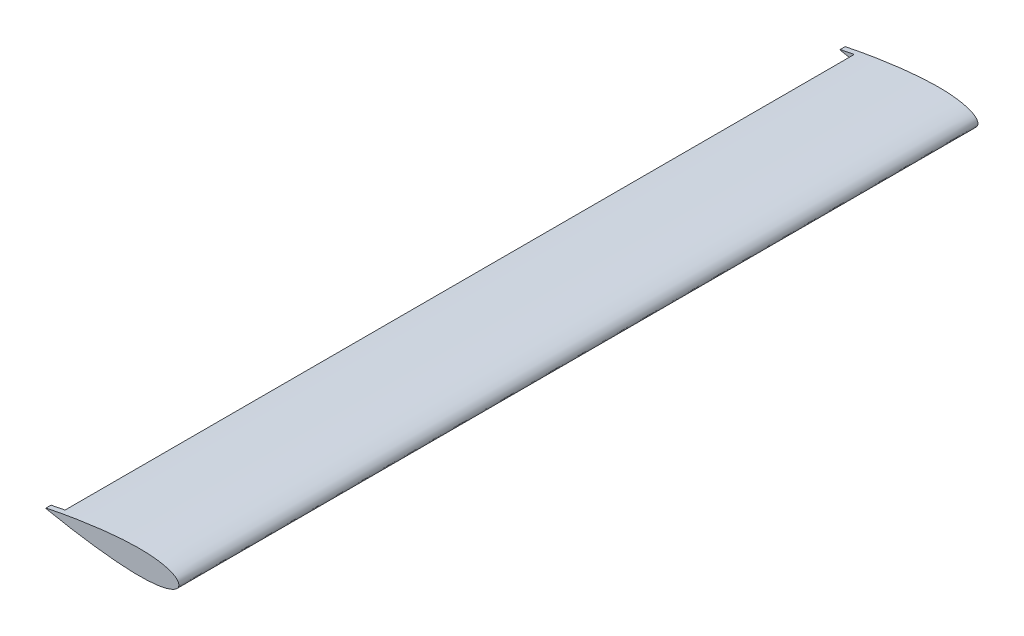
ISO-10303-21;
HEADER;
FILE_DESCRIPTION(('STEP AP214'),'2;1');
FILE_NAME('part.step','',(''),(''),'','','');
FILE_SCHEMA(('AUTOMOTIVE_DESIGN { 1 0 10303 214 1 1 1 1 }'));
ENDSEC;
DATA;
#1=APPLICATION_CONTEXT('core data for automotive mechanical design processes');
#2=APPLICATION_PROTOCOL_DEFINITION('international standard','automotive_design',2000,#1);
#3=PRODUCT_CONTEXT('',#1,'mechanical');
#4=PRODUCT('Part','Part','',(#3));
#5=PRODUCT_RELATED_PRODUCT_CATEGORY('part','',(#4));
#6=PRODUCT_DEFINITION_FORMATION('','',#4);
#7=PRODUCT_DEFINITION_CONTEXT('part definition',#1,'design');
#8=PRODUCT_DEFINITION('design','',#6,#7);
#9=PRODUCT_DEFINITION_SHAPE('','',#8);
#10=(LENGTH_UNIT() NAMED_UNIT(*) SI_UNIT(.MILLI.,.METRE.));
#11=(NAMED_UNIT(*) PLANE_ANGLE_UNIT() SI_UNIT($,.RADIAN.));
#12=(NAMED_UNIT(*) SI_UNIT($,.STERADIAN.) SOLID_ANGLE_UNIT());
#13=UNCERTAINTY_MEASURE_WITH_UNIT(LENGTH_MEASURE(1.E-05),#10,'distance_accuracy_value','');
#14=(GEOMETRIC_REPRESENTATION_CONTEXT(3) GLOBAL_UNCERTAINTY_ASSIGNED_CONTEXT((#13)) GLOBAL_UNIT_ASSIGNED_CONTEXT((#10,
#11,#12)) REPRESENTATION_CONTEXT('',''));
#15=CARTESIAN_POINT('',(0.,0.,0.));
#16=DIRECTION('',(0.,0.,1.));
#17=DIRECTION('',(1.,0.,0.));
#18=AXIS2_PLACEMENT_3D('',#15,#16,#17);
#19=CARTESIAN_POINT('',(-265.999999999999,-0.503000000467428,800.));
#20=CARTESIAN_POINT('',(-261.568824613127,-1.41910493794682,800.));
#21=CARTESIAN_POINT('',(-252.716442874089,-3.24925380626102,800.));
#22=CARTESIAN_POINT('',(-234.995464142612,-6.64481991794921,800.));
#23=CARTESIAN_POINT('',(-212.843288824471,-10.5485288362705,800.));
#24=CARTESIAN_POINT('',(-186.239809232107,-14.7042798016418,800.));
#25=CARTESIAN_POINT('',(-159.640651569451,-18.3128469708548,800.));
#26=CARTESIAN_POINT('',(-133.040852361654,-21.2623525177975,800.));
#27=CARTESIAN_POINT('',(-106.434765804828,-23.3530401063583,800.));
#28=CARTESIAN_POINT('',(-84.236960535237,-24.0962408200567,800.));
#29=CARTESIAN_POINT('',(-66.4892669119629,-23.7998937302964,800.));
#30=CARTESIAN_POINT('',(-53.1677388629969,-23.0109475445305,800.));
#31=CARTESIAN_POINT('',(-39.8211485531244,-21.4880571787925,800.));
#32=CARTESIAN_POINT('',(-28.7128335803096,-19.3599045445356,800.));
#33=CARTESIAN_POINT('',(-19.8529586715222,-16.8284915630262,800.));
#34=CARTESIAN_POINT('',(-13.0873654133834,-14.2708296517311,800.));
#35=CARTESIAN_POINT('',(-7.41956020196074,-11.1922678624387,800.));
#36=CARTESIAN_POINT('',(-2.20731315294942,-6.93210672242582,800.));
#37=CARTESIAN_POINT('',(1.44035156805781,2.05190266769401E-10,800.));
#38=CARTESIAN_POINT('',(-2.20731315298429,6.9321067228178,800.));
#39=CARTESIAN_POINT('',(-7.41956020201701,11.1922678628044,800.));
#40=CARTESIAN_POINT('',(-13.0873654134552,14.2708296520684,800.));
#41=CARTESIAN_POINT('',(-19.8529586716068,16.8284915633294,800.));
#42=CARTESIAN_POINT('',(-28.712833580407,19.3599045447942,800.));
#43=CARTESIAN_POINT('',(-39.8211485532324,21.4880571789953,800.));
#44=CARTESIAN_POINT('',(-53.1677388631127,23.0109475446662,800.));
#45=CARTESIAN_POINT('',(-66.4892669120825,23.799893730365,800.));
#46=CARTESIAN_POINT('',(-84.2369605353583,24.0962408200361,800.));
#47=CARTESIAN_POINT('',(-106.434765804945,23.353040106226,800.));
#48=CARTESIAN_POINT('',(-133.040852361761,21.2623525175314,800.));
#49=CARTESIAN_POINT('',(-159.640651569543,18.3128469704549,800.));
#50=CARTESIAN_POINT('',(-186.239809232181,14.7042798011081,800.));
#51=CARTESIAN_POINT('',(-212.843288824524,10.548528835603,800.));
#52=CARTESIAN_POINT('',(-234.995464142645,6.6448199171703,800.));
#53=CARTESIAN_POINT('',(-252.716442874106,3.24925380539299,800.));
#54=CARTESIAN_POINT('',(-261.568824613134,1.41910493703425,800.));
#55=CARTESIAN_POINT('',(-266.000000000001,0.502999999532572,800.));
#56=B_SPLINE_CURVE_WITH_KNOTS('',3,(#19,#20,#21,#22,#23,#24,#25,#26,#27,#28,#29,#30,#31,#32,#33,
#34,#35,#36,#37,#38,#39,#40,#41,#42,#43,#44,#45,#46,#47,#48,#49,#50,#51,#52,#53,#54,#55),
.UNSPECIFIED.,.F.,.F.,(4,1,1,1,1,1,1,1,1,1,1,1,1,1,1,1,1,1,1,1,1,1,1,1,1,1,1,1,1,1,1,1,1,1,4),
(0.,0.0246038933451094,0.0491524340929429,0.0981085566584546,0.146905125159748,
0.195554766723559,0.244056172228335,0.2924094136053,0.340643604803074,0.364753980610275,
0.388905472973926,0.413177962040512,0.437756077223996,0.45030461507737,0.463229874886268,
0.477067413917468,0.485035659177221,0.5,0.514964340822779,0.522932586082532,0.536770125113732,
0.54969538492263,0.562243922776004,0.586822037959488,0.611094527026074,0.635246019389725,
0.659356395196926,0.7075905863947,0.755943827771665,0.804445233276441,0.853094874840252,
0.901891443341545,0.950847565907057,0.975396106654891,1.),.UNSPECIFIED.);
#57=DIRECTION('',(0.,0.,-1.));
#58=VECTOR('',#57,1.);
#59=SURFACE_OF_LINEAR_EXTRUSION('',#56,#58);
#60=CARTESIAN_POINT('',(-265.999999999999,-0.503000000467428,-790.));
#61=CARTESIAN_POINT('',(-261.568824613127,-1.41910493794682,-790.));
#62=CARTESIAN_POINT('',(-252.716442874089,-3.24925380626102,-790.));
#63=CARTESIAN_POINT('',(-234.995464142612,-6.64481991794921,-790.));
#64=CARTESIAN_POINT('',(-212.843288824471,-10.5485288362705,-790.));
#65=CARTESIAN_POINT('',(-186.239809232107,-14.7042798016418,-790.));
#66=CARTESIAN_POINT('',(-159.640651569451,-18.3128469708548,-790.));
#67=CARTESIAN_POINT('',(-133.040852361654,-21.2623525177975,-790.));
#68=CARTESIAN_POINT('',(-106.434765804828,-23.3530401063583,-790.));
#69=CARTESIAN_POINT('',(-84.236960535237,-24.0962408200567,-790.));
#70=CARTESIAN_POINT('',(-66.4892669119629,-23.7998937302964,-790.));
#71=CARTESIAN_POINT('',(-53.1677388629969,-23.0109475445305,-790.));
#72=CARTESIAN_POINT('',(-39.8211485531244,-21.4880571787925,-790.));
#73=CARTESIAN_POINT('',(-28.7128335803096,-19.3599045445356,-790.));
#74=CARTESIAN_POINT('',(-19.8529586715222,-16.8284915630262,-790.));
#75=CARTESIAN_POINT('',(-13.0873654133834,-14.2708296517311,-790.));
#76=CARTESIAN_POINT('',(-7.41956020196074,-11.1922678624387,-790.));
#77=CARTESIAN_POINT('',(-2.20731315294942,-6.93210672242582,-790.));
#78=CARTESIAN_POINT('',(1.44035156805781,2.05190266769401E-10,-790.));
#79=CARTESIAN_POINT('',(-2.20731315298429,6.9321067228178,-790.));
#80=CARTESIAN_POINT('',(-7.41956020201701,11.1922678628044,-790.));
#81=CARTESIAN_POINT('',(-13.0873654134552,14.2708296520684,-790.));
#82=CARTESIAN_POINT('',(-19.8529586716068,16.8284915633294,-790.));
#83=CARTESIAN_POINT('',(-28.712833580407,19.3599045447942,-790.));
#84=CARTESIAN_POINT('',(-39.8211485532324,21.4880571789953,-790.));
#85=CARTESIAN_POINT('',(-53.1677388631127,23.0109475446662,-790.));
#86=CARTESIAN_POINT('',(-66.4892669120825,23.799893730365,-790.));
#87=CARTESIAN_POINT('',(-84.2369605353583,24.0962408200361,-790.));
#88=CARTESIAN_POINT('',(-106.434765804945,23.353040106226,-790.));
#89=CARTESIAN_POINT('',(-133.040852361761,21.2623525175314,-790.));
#90=CARTESIAN_POINT('',(-159.640651569543,18.3128469704549,-790.));
#91=CARTESIAN_POINT('',(-186.239809232181,14.7042798011081,-790.));
#92=CARTESIAN_POINT('',(-212.843288824524,10.548528835603,-790.));
#93=CARTESIAN_POINT('',(-234.995464142645,6.6448199171703,-790.));
#94=CARTESIAN_POINT('',(-252.716442874106,3.24925380539299,-790.));
#95=CARTESIAN_POINT('',(-261.568824613134,1.41910493703425,-790.));
#96=CARTESIAN_POINT('',(-266.000000000001,0.502999999532572,-790.));
#97=B_SPLINE_CURVE_WITH_KNOTS('',3,(#60,#61,#62,#63,#64,#65,#66,#67,#68,#69,#70,#71,#72,#73,#74,
#75,#76,#77,#78,#79,#80,#81,#82,#83,#84,#85,#86,#87,#88,#89,#90,#91,#92,#93,#94,#95,#96),
.UNSPECIFIED.,.F.,.F.,(4,1,1,1,1,1,1,1,1,1,1,1,1,1,1,1,1,1,1,1,1,1,1,1,1,1,1,1,1,1,1,1,1,1,4),
(0.,0.0246038933451094,0.0491524340929429,0.0981085566584546,0.146905125159748,
0.195554766723559,0.244056172228335,0.2924094136053,0.340643604803074,0.364753980610275,
0.388905472973926,0.413177962040512,0.437756077223996,0.45030461507737,0.463229874886268,
0.477067413917468,0.485035659177221,0.5,0.514964340822779,0.522932586082532,0.536770125113732,
0.54969538492263,0.562243922776004,0.586822037959488,0.611094527026074,0.635246019389725,
0.659356395196926,0.7075905863947,0.755943827771665,0.804445233276441,0.853094874840252,
0.901891443341545,0.950847565907057,0.975396106654891,1.),.UNSPECIFIED.);
#98=CARTESIAN_POINT('',(-265.999999999999,-0.503000000467428,-790.));
#99=VERTEX_POINT('',#98);
#100=CARTESIAN_POINT('',(-237.807743209999,-6.07391839642226,-790.));
#101=VERTEX_POINT('',#100);
#102=EDGE_CURVE('E83',#99,#101,#97,.T.);
#103=ORIENTED_EDGE('',*,*,#102,.F.);
#104=DIRECTION('',(0.,0.,-1.));
#105=VECTOR('',#104,1.);
#106=CARTESIAN_POINT('',(-265.999999999999,-0.503000000467428,800.));
#107=LINE('',#106,#105);
#108=CARTESIAN_POINT('',(-265.999999999999,-0.503000000467428,-800.));
#109=VERTEX_POINT('',#108);
#110=EDGE_CURVE('E76',#99,#109,#107,.T.);
#111=ORIENTED_EDGE('',*,*,#110,.T.);
#112=CARTESIAN_POINT('',(-265.999999999999,-0.503000000467428,-800.));
#113=CARTESIAN_POINT('',(-261.568824613127,-1.41910493794682,-800.));
#114=CARTESIAN_POINT('',(-252.716442874089,-3.24925380626102,-800.));
#115=CARTESIAN_POINT('',(-234.995464142612,-6.64481991794921,-800.));
#116=CARTESIAN_POINT('',(-212.843288824471,-10.5485288362705,-800.));
#117=CARTESIAN_POINT('',(-186.239809232107,-14.7042798016418,-800.));
#118=CARTESIAN_POINT('',(-159.640651569451,-18.3128469708548,-800.));
#119=CARTESIAN_POINT('',(-133.040852361654,-21.2623525177975,-800.));
#120=CARTESIAN_POINT('',(-106.434765804828,-23.3530401063583,-800.));
#121=CARTESIAN_POINT('',(-84.236960535237,-24.0962408200567,-800.));
#122=CARTESIAN_POINT('',(-66.4892669119629,-23.7998937302964,-800.));
#123=CARTESIAN_POINT('',(-53.1677388629969,-23.0109475445305,-800.));
#124=CARTESIAN_POINT('',(-39.8211485531244,-21.4880571787925,-800.));
#125=CARTESIAN_POINT('',(-28.7128335803096,-19.3599045445356,-800.));
#126=CARTESIAN_POINT('',(-19.8529586715222,-16.8284915630262,-800.));
#127=CARTESIAN_POINT('',(-13.0873654133834,-14.2708296517311,-800.));
#128=CARTESIAN_POINT('',(-7.41956020196074,-11.1922678624387,-800.));
#129=CARTESIAN_POINT('',(-2.20731315294942,-6.93210672242582,-800.));
#130=CARTESIAN_POINT('',(1.44035156805781,2.05190266769401E-10,-800.));
#131=CARTESIAN_POINT('',(-2.20731315298429,6.9321067228178,-800.));
#132=CARTESIAN_POINT('',(-7.41956020201701,11.1922678628044,-800.));
#133=CARTESIAN_POINT('',(-13.0873654134552,14.2708296520684,-800.));
#134=CARTESIAN_POINT('',(-19.8529586716068,16.8284915633294,-800.));
#135=CARTESIAN_POINT('',(-28.712833580407,19.3599045447942,-800.));
#136=CARTESIAN_POINT('',(-39.8211485532324,21.4880571789953,-800.));
#137=CARTESIAN_POINT('',(-53.1677388631127,23.0109475446662,-800.));
#138=CARTESIAN_POINT('',(-66.4892669120825,23.799893730365,-800.));
#139=CARTESIAN_POINT('',(-84.2369605353583,24.0962408200361,-800.));
#140=CARTESIAN_POINT('',(-106.434765804945,23.353040106226,-800.));
#141=CARTESIAN_POINT('',(-133.040852361761,21.2623525175314,-800.));
#142=CARTESIAN_POINT('',(-159.640651569543,18.3128469704549,-800.));
#143=CARTESIAN_POINT('',(-186.239809232181,14.7042798011081,-800.));
#144=CARTESIAN_POINT('',(-212.843288824524,10.548528835603,-800.));
#145=CARTESIAN_POINT('',(-234.995464142645,6.6448199171703,-800.));
#146=CARTESIAN_POINT('',(-252.716442874106,3.24925380539299,-800.));
#147=CARTESIAN_POINT('',(-261.568824613134,1.41910493703425,-800.));
#148=CARTESIAN_POINT('',(-266.000000000001,0.502999999532572,-800.));
#149=B_SPLINE_CURVE_WITH_KNOTS('',3,(#112,#113,#114,#115,#116,#117,#118,#119,#120,#121,#122,
#123,#124,#125,#126,#127,#128,#129,#130,#131,#132,#133,#134,#135,#136,#137,#138,#139,#140,#141,
#142,#143,#144,#145,#146,#147,#148),.UNSPECIFIED.,.F.,.F.,(4,1,1,1,1,1,1,1,1,1,1,1,1,1,1,1,1,1,
1,1,1,1,1,1,1,1,1,1,1,1,1,1,1,1,4),(0.,0.0246038933451094,0.0491524340929429,0.0981085566584546,
0.146905125159748,0.195554766723559,0.244056172228335,0.2924094136053,0.340643604803074,
0.364753980610275,0.388905472973926,0.413177962040512,0.437756077223996,0.45030461507737,
0.463229874886268,0.477067413917468,0.485035659177221,0.5,0.514964340822779,0.522932586082532,
0.536770125113732,0.54969538492263,0.562243922776004,0.586822037959488,0.611094527026074,
0.635246019389725,0.659356395196926,0.7075905863947,0.755943827771665,0.804445233276441,
0.853094874840252,0.901891443341545,0.950847565907057,0.975396106654891,1.),.UNSPECIFIED.);
#150=CARTESIAN_POINT('',(-266.000000000001,0.502999999532572,-800.));
#151=VERTEX_POINT('',#150);
#152=EDGE_CURVE('E80',#109,#151,#149,.T.);
#153=ORIENTED_EDGE('',*,*,#152,.T.);
#154=DIRECTION('',(0.,0.,-1.));
#155=VECTOR('',#154,1.);
#156=CARTESIAN_POINT('',(-266.000000000001,0.502999999532572,800.));
#157=LINE('',#156,#155);
#158=CARTESIAN_POINT('',(-266.000000000001,0.502999999532572,-790.));
#159=VERTEX_POINT('',#158);
#160=EDGE_CURVE('E91',#159,#151,#157,.T.);
#161=ORIENTED_EDGE('',*,*,#160,.F.);
#162=CARTESIAN_POINT('',(-237.807743209999,6.07391839563488,-790.));
#163=VERTEX_POINT('',#162);
#164=EDGE_CURVE('E97',#163,#159,#97,.T.);
#165=ORIENTED_EDGE('',*,*,#164,.F.);
#166=DIRECTION('',(0.,0.,1.));
#167=VECTOR('',#166,1.);
#168=CARTESIAN_POINT('',(-237.807743209999,6.07391839563488,-790.));
#169=LINE('',#168,#167);
#170=CARTESIAN_POINT('',(-237.807743209999,6.07391839563488,790.));
#171=VERTEX_POINT('',#170);
#172=EDGE_CURVE('E134',#163,#171,#169,.T.);
#173=ORIENTED_EDGE('',*,*,#172,.T.);
#174=CARTESIAN_POINT('',(-265.999999999999,-0.503000000467428,790.));
#175=CARTESIAN_POINT('',(-261.568824613127,-1.41910493794682,790.));
#176=CARTESIAN_POINT('',(-252.716442874089,-3.24925380626102,790.));
#177=CARTESIAN_POINT('',(-234.995464142612,-6.64481991794921,790.));
#178=CARTESIAN_POINT('',(-212.843288824471,-10.5485288362705,790.));
#179=CARTESIAN_POINT('',(-186.239809232107,-14.7042798016418,790.));
#180=CARTESIAN_POINT('',(-159.640651569451,-18.3128469708548,790.));
#181=CARTESIAN_POINT('',(-133.040852361654,-21.2623525177975,790.));
#182=CARTESIAN_POINT('',(-106.434765804828,-23.3530401063583,790.));
#183=CARTESIAN_POINT('',(-84.236960535237,-24.0962408200567,790.));
#184=CARTESIAN_POINT('',(-66.4892669119629,-23.7998937302964,790.));
#185=CARTESIAN_POINT('',(-53.1677388629969,-23.0109475445305,790.));
#186=CARTESIAN_POINT('',(-39.8211485531244,-21.4880571787925,790.));
#187=CARTESIAN_POINT('',(-28.7128335803096,-19.3599045445356,790.));
#188=CARTESIAN_POINT('',(-19.8529586715222,-16.8284915630262,790.));
#189=CARTESIAN_POINT('',(-13.0873654133834,-14.2708296517311,790.));
#190=CARTESIAN_POINT('',(-7.41956020196074,-11.1922678624387,790.));
#191=CARTESIAN_POINT('',(-2.20731315294942,-6.93210672242582,790.));
#192=CARTESIAN_POINT('',(1.44035156805781,2.05190266769401E-10,790.));
#193=CARTESIAN_POINT('',(-2.20731315298429,6.9321067228178,790.));
#194=CARTESIAN_POINT('',(-7.41956020201701,11.1922678628044,790.));
#195=CARTESIAN_POINT('',(-13.0873654134552,14.2708296520684,790.));
#196=CARTESIAN_POINT('',(-19.8529586716068,16.8284915633294,790.));
#197=CARTESIAN_POINT('',(-28.712833580407,19.3599045447942,790.));
#198=CARTESIAN_POINT('',(-39.8211485532324,21.4880571789953,790.));
#199=CARTESIAN_POINT('',(-53.1677388631127,23.0109475446662,790.));
#200=CARTESIAN_POINT('',(-66.4892669120825,23.799893730365,790.));
#201=CARTESIAN_POINT('',(-84.2369605353583,24.0962408200361,790.));
#202=CARTESIAN_POINT('',(-106.434765804945,23.353040106226,790.));
#203=CARTESIAN_POINT('',(-133.040852361761,21.2623525175314,790.));
#204=CARTESIAN_POINT('',(-159.640651569543,18.3128469704549,790.));
#205=CARTESIAN_POINT('',(-186.239809232181,14.7042798011081,790.));
#206=CARTESIAN_POINT('',(-212.843288824524,10.548528835603,790.));
#207=CARTESIAN_POINT('',(-234.995464142645,6.6448199171703,790.));
#208=CARTESIAN_POINT('',(-252.716442874106,3.24925380539299,790.));
#209=CARTESIAN_POINT('',(-261.568824613134,1.41910493703425,790.));
#210=CARTESIAN_POINT('',(-266.000000000001,0.502999999532572,790.));
#211=B_SPLINE_CURVE_WITH_KNOTS('',3,(#174,#175,#176,#177,#178,#179,#180,#181,#182,#183,#184,
#185,#186,#187,#188,#189,#190,#191,#192,#193,#194,#195,#196,#197,#198,#199,#200,#201,#202,#203,
#204,#205,#206,#207,#208,#209,#210),.UNSPECIFIED.,.F.,.F.,(4,1,1,1,1,1,1,1,1,1,1,1,1,1,1,1,1,1,
1,1,1,1,1,1,1,1,1,1,1,1,1,1,1,1,4),(0.,0.0246038933451094,0.0491524340929429,0.0981085566584546,
0.146905125159748,0.195554766723559,0.244056172228335,0.2924094136053,0.340643604803074,
0.364753980610275,0.388905472973926,0.413177962040512,0.437756077223996,0.45030461507737,
0.463229874886268,0.477067413917468,0.485035659177221,0.5,0.514964340822779,0.522932586082532,
0.536770125113732,0.54969538492263,0.562243922776004,0.586822037959488,0.611094527026074,
0.635246019389725,0.659356395196926,0.7075905863947,0.755943827771665,0.804445233276441,
0.853094874840252,0.901891443341545,0.950847565907057,0.975396106654891,1.),.UNSPECIFIED.);
#212=CARTESIAN_POINT('',(-266.000000000001,0.502999999532572,790.));
#213=VERTEX_POINT('',#212);
#214=EDGE_CURVE('E127',#171,#213,#211,.T.);
#215=ORIENTED_EDGE('',*,*,#214,.T.);
#216=CARTESIAN_POINT('',(-266.000000000001,0.502999999532572,800.));
#217=VERTEX_POINT('',#216);
#218=EDGE_CURVE('E107',#217,#213,#157,.T.);
#219=ORIENTED_EDGE('',*,*,#218,.F.);
#220=CARTESIAN_POINT('',(-265.999999999999,-0.503000000467428,800.));
#221=VERTEX_POINT('',#220);
#222=EDGE_CURVE('E93',#221,#217,#56,.T.);
#223=ORIENTED_EDGE('',*,*,#222,.F.);
#224=CARTESIAN_POINT('',(-265.999999999999,-0.503000000467428,790.));
#225=VERTEX_POINT('',#224);
#226=EDGE_CURVE('E86',#221,#225,#107,.T.);
#227=ORIENTED_EDGE('',*,*,#226,.T.);
#228=CARTESIAN_POINT('',(-237.807743209999,-6.07391839642226,790.));
#229=VERTEX_POINT('',#228);
#230=EDGE_CURVE('E54',#225,#229,#211,.T.);
#231=ORIENTED_EDGE('',*,*,#230,.T.);
#232=DIRECTION('',(0.,0.,1.));
#233=VECTOR('',#232,1.);
#234=CARTESIAN_POINT('',(-237.807743209999,-6.07391839642226,-790.));
#235=LINE('',#234,#233);
#236=EDGE_CURVE('E135',#101,#229,#235,.T.);
#237=ORIENTED_EDGE('',*,*,#236,.F.);
#238=EDGE_LOOP('',(#103,#111,#153,#161,#165,#173,#215,#219,#223,#227,#231,#237));
#239=FACE_BOUND('',#238,.T.);
#240=ADVANCED_FACE('F39',(#239),#59,.F.);
#241=CARTESIAN_POINT('',(-265.999999999999,-0.503000000467428,800.));
#242=DIRECTION('',(1.,2.42792311548245E-12,0.));
#243=DIRECTION('',(-2.42792311548245E-12,1.,0.));
#244=AXIS2_PLACEMENT_3D('',#241,#242,#243);
#245=PLANE('',#244);
#246=DIRECTION('',(2.42792311548245E-12,-1.,0.));
#247=VECTOR('',#246,1.);
#248=CARTESIAN_POINT('',(-265.999999999999,-0.503000000467428,-790.));
#249=LINE('',#248,#247);
#250=EDGE_CURVE('E11',#159,#99,#249,.T.);
#251=ORIENTED_EDGE('',*,*,#250,.F.);
#252=ORIENTED_EDGE('',*,*,#160,.T.);
#253=DIRECTION('',(2.42792311548245E-12,-1.,0.));
#254=VECTOR('',#253,1.);
#255=CARTESIAN_POINT('',(-265.999999999999,-0.503000000467428,-800.));
#256=LINE('',#255,#254);
#257=EDGE_CURVE('E89',#151,#109,#256,.T.);
#258=ORIENTED_EDGE('',*,*,#257,.T.);
#259=ORIENTED_EDGE('',*,*,#110,.F.);
#260=EDGE_LOOP('',(#251,#252,#258,#259));
#261=FACE_BOUND('',#260,.T.);
#262=ADVANCED_FACE('F90',(#261),#245,.F.);
#263=ORIENTED_EDGE('',*,*,#218,.T.);
#264=DIRECTION('',(2.42792311548245E-12,-1.,0.));
#265=VECTOR('',#264,1.);
#266=CARTESIAN_POINT('',(-265.999999999999,-0.503000000467428,790.));
#267=LINE('',#266,#265);
#268=EDGE_CURVE('E47',#213,#225,#267,.T.);
#269=ORIENTED_EDGE('',*,*,#268,.T.);
#270=ORIENTED_EDGE('',*,*,#226,.F.);
#271=DIRECTION('',(2.42792311548245E-12,-1.,0.));
#272=VECTOR('',#271,1.);
#273=CARTESIAN_POINT('',(-265.999999999999,-0.503000000467428,800.));
#274=LINE('',#273,#272);
#275=EDGE_CURVE('E62',#217,#221,#274,.T.);
#276=ORIENTED_EDGE('',*,*,#275,.F.);
#277=EDGE_LOOP('',(#263,#269,#270,#276));
#278=FACE_BOUND('',#277,.T.);
#279=ADVANCED_FACE('F110',(#278),#245,.F.);
#280=CARTESIAN_POINT('',(-1.10913882245255E-13,2.01548413375496E-10,800.));
#281=DIRECTION('',(0.,0.,1.));
#282=DIRECTION('',(1.,0.,0.));
#283=AXIS2_PLACEMENT_3D('',#280,#281,#282);
#284=PLANE('',#283);
#285=ORIENTED_EDGE('',*,*,#222,.T.);
#286=ORIENTED_EDGE('',*,*,#275,.T.);
#287=EDGE_LOOP('',(#285,#286));
#288=FACE_BOUND('',#287,.T.);
#289=ADVANCED_FACE('F182',(#288),#284,.T.);
#290=CARTESIAN_POINT('',(-1.10913882245255E-13,2.01548413375496E-10,-800.));
#291=DIRECTION('',(0.,0.,1.));
#292=DIRECTION('',(1.,0.,0.));
#293=AXIS2_PLACEMENT_3D('',#290,#291,#292);
#294=PLANE('',#293);
#295=ORIENTED_EDGE('',*,*,#152,.F.);
#296=ORIENTED_EDGE('',*,*,#257,.F.);
#297=EDGE_LOOP('',(#295,#296));
#298=FACE_BOUND('',#297,.T.);
#299=ADVANCED_FACE('F95',(#298),#294,.F.);
#300=CARTESIAN_POINT('',(-252.869926619878,-3.45752706920195,-790.));
#301=DIRECTION('',(0.,0.,1.));
#302=DIRECTION('',(1.,0.,0.));
#303=AXIS2_PLACEMENT_3D('',#300,#301,#302);
#304=PLANE('',#303);
#305=ORIENTED_EDGE('',*,*,#102,.T.);
#306=DIRECTION('',(0.,1.,0.));
#307=VECTOR('',#306,1.);
#308=CARTESIAN_POINT('',(-237.807743209999,-6.07391839642226,-790.));
#309=LINE('',#308,#307);
#310=EDGE_CURVE('E141',#101,#163,#309,.T.);
#311=ORIENTED_EDGE('',*,*,#310,.T.);
#312=ORIENTED_EDGE('',*,*,#164,.T.);
#313=ORIENTED_EDGE('',*,*,#250,.T.);
#314=EDGE_LOOP('',(#305,#311,#312,#313));
#315=FACE_BOUND('',#314,.T.);
#316=ADVANCED_FACE('F152',(#315),#304,.T.);
#317=CARTESIAN_POINT('',(-252.869926619878,-3.45752706920195,790.));
#318=DIRECTION('',(0.,0.,1.));
#319=DIRECTION('',(1.,0.,0.));
#320=AXIS2_PLACEMENT_3D('',#317,#318,#319);
#321=PLANE('',#320);
#322=ORIENTED_EDGE('',*,*,#268,.F.);
#323=ORIENTED_EDGE('',*,*,#214,.F.);
#324=DIRECTION('',(0.,1.,0.));
#325=VECTOR('',#324,1.);
#326=CARTESIAN_POINT('',(-237.807743209999,-6.07391839642226,790.));
#327=LINE('',#326,#325);
#328=EDGE_CURVE('E144',#229,#171,#327,.T.);
#329=ORIENTED_EDGE('',*,*,#328,.F.);
#330=ORIENTED_EDGE('',*,*,#230,.F.);
#331=EDGE_LOOP('',(#322,#323,#329,#330));
#332=FACE_BOUND('',#331,.T.);
#333=ADVANCED_FACE('F165',(#332),#321,.F.);
#334=CARTESIAN_POINT('',(-237.807743209999,-6.07391839642226,-790.));
#335=DIRECTION('',(1.,0.,0.));
#336=DIRECTION('',(0.,1.,0.));
#337=AXIS2_PLACEMENT_3D('',#334,#335,#336);
#338=PLANE('',#337);
#339=ORIENTED_EDGE('',*,*,#328,.T.);
#340=ORIENTED_EDGE('',*,*,#172,.F.);
#341=ORIENTED_EDGE('',*,*,#310,.F.);
#342=ORIENTED_EDGE('',*,*,#236,.T.);
#343=EDGE_LOOP('',(#339,#340,#341,#342));
#344=FACE_BOUND('',#343,.T.);
#345=ADVANCED_FACE('F164',(#344),#338,.F.);
#346=CLOSED_SHELL('',(#240,#262,#279,#289,#299,#316,#333,#345));
#347=MANIFOLD_SOLID_BREP('B2',#346);
#348=ADVANCED_BREP_SHAPE_REPRESENTATION('',(#18,#347),#14);
#349=SHAPE_DEFINITION_REPRESENTATION(#9,#348);
ENDSEC;
END-ISO-10303-21;
